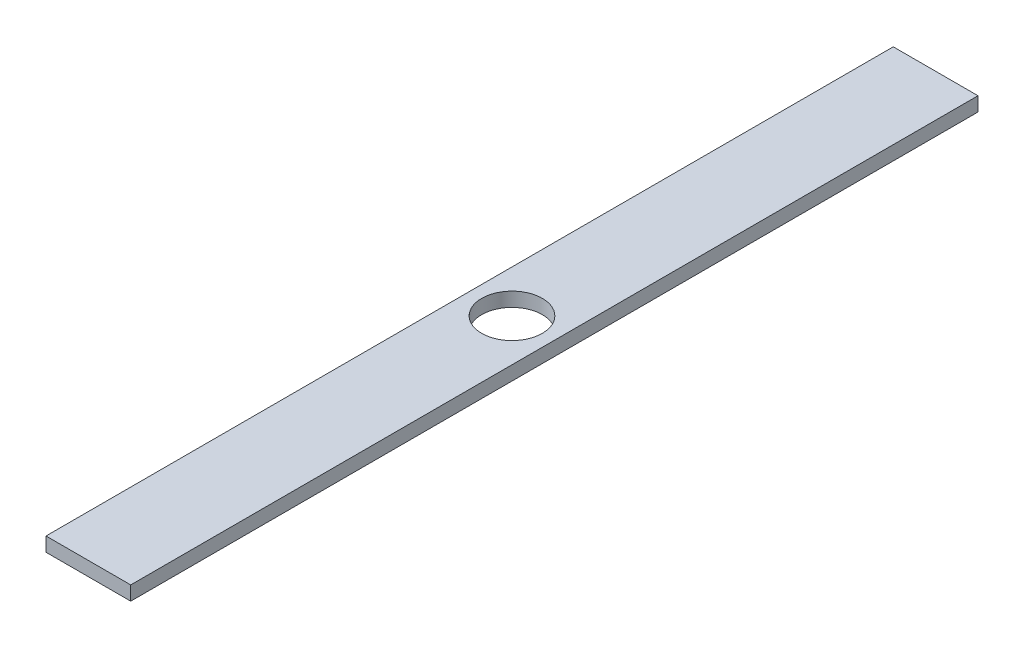
ISO-10303-21;
HEADER;
FILE_DESCRIPTION(('STEP AP214'),'2;1');
FILE_NAME('part.step','',(''),(''),'','','');
FILE_SCHEMA(('AUTOMOTIVE_DESIGN { 1 0 10303 214 1 1 1 1 }'));
ENDSEC;
DATA;
#1=APPLICATION_CONTEXT('core data for automotive mechanical design processes');
#2=APPLICATION_PROTOCOL_DEFINITION('international standard','automotive_design',2000,#1);
#3=PRODUCT_CONTEXT('',#1,'mechanical');
#4=PRODUCT('Part','Part','',(#3));
#5=PRODUCT_RELATED_PRODUCT_CATEGORY('part','',(#4));
#6=PRODUCT_DEFINITION_FORMATION('','',#4);
#7=PRODUCT_DEFINITION_CONTEXT('part definition',#1,'design');
#8=PRODUCT_DEFINITION('design','',#6,#7);
#9=PRODUCT_DEFINITION_SHAPE('','',#8);
#10=(LENGTH_UNIT() NAMED_UNIT(*) SI_UNIT(.MILLI.,.METRE.));
#11=(NAMED_UNIT(*) PLANE_ANGLE_UNIT() SI_UNIT($,.RADIAN.));
#12=(NAMED_UNIT(*) SI_UNIT($,.STERADIAN.) SOLID_ANGLE_UNIT());
#13=UNCERTAINTY_MEASURE_WITH_UNIT(LENGTH_MEASURE(1.E-05),#10,'distance_accuracy_value','');
#14=(GEOMETRIC_REPRESENTATION_CONTEXT(3) GLOBAL_UNCERTAINTY_ASSIGNED_CONTEXT((#13)) GLOBAL_UNIT_ASSIGNED_CONTEXT((#10,
#11,#12)) REPRESENTATION_CONTEXT('',''));
#15=CARTESIAN_POINT('',(0.,0.,0.));
#16=DIRECTION('',(0.,0.,1.));
#17=DIRECTION('',(1.,0.,0.));
#18=AXIS2_PLACEMENT_3D('',#15,#16,#17);
#19=CARTESIAN_POINT('',(0.,6.35,0.));
#20=DIRECTION('',(0.,-1.,0.));
#21=DIRECTION('',(0.,0.,-1.));
#22=AXIS2_PLACEMENT_3D('',#19,#20,#21);
#23=PLANE('',#22);
#24=DIRECTION('',(0.,0.,-1.));
#25=VECTOR('',#24,1.);
#26=CARTESIAN_POINT('',(19.05,6.35,190.5));
#27=LINE('',#26,#25);
#28=CARTESIAN_POINT('',(19.05,6.35,190.5));
#29=VERTEX_POINT('',#28);
#30=CARTESIAN_POINT('',(19.05,6.35,-190.5));
#31=VERTEX_POINT('',#30);
#32=EDGE_CURVE('E85',#29,#31,#27,.T.);
#33=ORIENTED_EDGE('',*,*,#32,.T.);
#34=DIRECTION('',(-1.,0.,0.));
#35=VECTOR('',#34,1.);
#36=CARTESIAN_POINT('',(-19.05,6.35,-190.5));
#37=LINE('',#36,#35);
#38=CARTESIAN_POINT('',(-19.05,6.35,-190.5));
#39=VERTEX_POINT('',#38);
#40=EDGE_CURVE('E80',#31,#39,#37,.T.);
#41=ORIENTED_EDGE('',*,*,#40,.T.);
#42=DIRECTION('',(0.,0.,1.));
#43=VECTOR('',#42,1.);
#44=CARTESIAN_POINT('',(-19.05,6.35,190.5));
#45=LINE('',#44,#43);
#46=CARTESIAN_POINT('',(-19.05,6.35,190.5));
#47=VERTEX_POINT('',#46);
#48=EDGE_CURVE('E83',#39,#47,#45,.T.);
#49=ORIENTED_EDGE('',*,*,#48,.T.);
#50=DIRECTION('',(1.,0.,0.));
#51=VECTOR('',#50,1.);
#52=CARTESIAN_POINT('',(-19.05,6.35,190.5));
#53=LINE('',#52,#51);
#54=EDGE_CURVE('E50',#47,#29,#53,.T.);
#55=ORIENTED_EDGE('',*,*,#54,.T.);
#56=EDGE_LOOP('',(#33,#41,#49,#55));
#57=FACE_BOUND('',#56,.T.);
#58=CARTESIAN_POINT('',(0.,6.35,0.));
#59=DIRECTION('',(0.,1.,0.));
#60=DIRECTION('',(0.,0.,1.));
#61=AXIS2_PLACEMENT_3D('',#58,#59,#60);
#62=CIRCLE('',#61,13.6319234191528);
#63=CARTESIAN_POINT('',(0.,6.35,13.6319234191528));
#64=VERTEX_POINT('',#63);
#65=EDGE_CURVE('E100',#64,#64,#62,.T.);
#66=ORIENTED_EDGE('',*,*,#65,.F.);
#67=EDGE_LOOP('',(#66));
#68=FACE_BOUND('',#67,.T.);
#69=ADVANCED_FACE('F33',(#57,#68),#23,.F.);
#70=CARTESIAN_POINT('',(0.,0.,0.));
#71=DIRECTION('',(0.,-1.,0.));
#72=DIRECTION('',(0.,0.,-1.));
#73=AXIS2_PLACEMENT_3D('',#70,#71,#72);
#74=PLANE('',#73);
#75=DIRECTION('',(0.,0.,-1.));
#76=VECTOR('',#75,1.);
#77=CARTESIAN_POINT('',(19.05,0.,190.5));
#78=LINE('',#77,#76);
#79=CARTESIAN_POINT('',(19.05,0.,190.5));
#80=VERTEX_POINT('',#79);
#81=CARTESIAN_POINT('',(19.05,0.,-190.5));
#82=VERTEX_POINT('',#81);
#83=EDGE_CURVE('E97',#80,#82,#78,.T.);
#84=ORIENTED_EDGE('',*,*,#83,.F.);
#85=DIRECTION('',(1.,0.,0.));
#86=VECTOR('',#85,1.);
#87=CARTESIAN_POINT('',(-19.05,0.,190.5));
#88=LINE('',#87,#86);
#89=CARTESIAN_POINT('',(-19.05,0.,190.5));
#90=VERTEX_POINT('',#89);
#91=EDGE_CURVE('E73',#90,#80,#88,.T.);
#92=ORIENTED_EDGE('',*,*,#91,.F.);
#93=DIRECTION('',(0.,0.,1.));
#94=VECTOR('',#93,1.);
#95=CARTESIAN_POINT('',(-19.05,0.,190.5));
#96=LINE('',#95,#94);
#97=CARTESIAN_POINT('',(-19.05,0.,-190.5));
#98=VERTEX_POINT('',#97);
#99=EDGE_CURVE('E67',#98,#90,#96,.T.);
#100=ORIENTED_EDGE('',*,*,#99,.F.);
#101=DIRECTION('',(-1.,0.,0.));
#102=VECTOR('',#101,1.);
#103=CARTESIAN_POINT('',(-19.05,0.,-190.5));
#104=LINE('',#103,#102);
#105=EDGE_CURVE('E89',#82,#98,#104,.T.);
#106=ORIENTED_EDGE('',*,*,#105,.F.);
#107=EDGE_LOOP('',(#84,#92,#100,#106));
#108=FACE_BOUND('',#107,.T.);
#109=CARTESIAN_POINT('',(0.,0.,0.));
#110=DIRECTION('',(0.,1.,0.));
#111=DIRECTION('',(0.,0.,1.));
#112=AXIS2_PLACEMENT_3D('',#109,#110,#111);
#113=CIRCLE('',#112,13.6319234191528);
#114=CARTESIAN_POINT('',(0.,0.,13.6319234191528));
#115=VERTEX_POINT('',#114);
#116=EDGE_CURVE('E112',#115,#115,#113,.T.);
#117=ORIENTED_EDGE('',*,*,#116,.T.);
#118=EDGE_LOOP('',(#117));
#119=FACE_BOUND('',#118,.T.);
#120=ADVANCED_FACE('F108',(#108,#119),#74,.T.);
#121=CARTESIAN_POINT('',(19.05,6.35,190.5));
#122=DIRECTION('',(-1.,0.,0.));
#123=DIRECTION('',(0.,0.,1.));
#124=AXIS2_PLACEMENT_3D('',#121,#122,#123);
#125=PLANE('',#124);
#126=ORIENTED_EDGE('',*,*,#83,.T.);
#127=DIRECTION('',(0.,-1.,0.));
#128=VECTOR('',#127,1.);
#129=CARTESIAN_POINT('',(19.05,6.35,-190.5));
#130=LINE('',#129,#128);
#131=EDGE_CURVE('E11',#31,#82,#130,.T.);
#132=ORIENTED_EDGE('',*,*,#131,.F.);
#133=ORIENTED_EDGE('',*,*,#32,.F.);
#134=DIRECTION('',(0.,-1.,0.));
#135=VECTOR('',#134,1.);
#136=CARTESIAN_POINT('',(19.05,6.35,190.5));
#137=LINE('',#136,#135);
#138=EDGE_CURVE('E93',#29,#80,#137,.T.);
#139=ORIENTED_EDGE('',*,*,#138,.T.);
#140=EDGE_LOOP('',(#126,#132,#133,#139));
#141=FACE_BOUND('',#140,.T.);
#142=ADVANCED_FACE('F35',(#141),#125,.F.);
#143=CARTESIAN_POINT('',(-19.05,6.35,-190.5));
#144=DIRECTION('',(0.,0.,1.));
#145=DIRECTION('',(1.,0.,0.));
#146=AXIS2_PLACEMENT_3D('',#143,#144,#145);
#147=PLANE('',#146);
#148=ORIENTED_EDGE('',*,*,#105,.T.);
#149=DIRECTION('',(0.,-1.,0.));
#150=VECTOR('',#149,1.);
#151=CARTESIAN_POINT('',(-19.05,6.35,-190.5));
#152=LINE('',#151,#150);
#153=EDGE_CURVE('E42',#39,#98,#152,.T.);
#154=ORIENTED_EDGE('',*,*,#153,.F.);
#155=ORIENTED_EDGE('',*,*,#40,.F.);
#156=ORIENTED_EDGE('',*,*,#131,.T.);
#157=EDGE_LOOP('',(#148,#154,#155,#156));
#158=FACE_BOUND('',#157,.T.);
#159=ADVANCED_FACE('F88',(#158),#147,.F.);
#160=CARTESIAN_POINT('',(-19.05,6.35,190.5));
#161=DIRECTION('',(1.,0.,0.));
#162=DIRECTION('',(0.,0.,-1.));
#163=AXIS2_PLACEMENT_3D('',#160,#161,#162);
#164=PLANE('',#163);
#165=ORIENTED_EDGE('',*,*,#99,.T.);
#166=DIRECTION('',(0.,-1.,0.));
#167=VECTOR('',#166,1.);
#168=CARTESIAN_POINT('',(-19.05,6.35,190.5));
#169=LINE('',#168,#167);
#170=EDGE_CURVE('E90',#47,#90,#169,.T.);
#171=ORIENTED_EDGE('',*,*,#170,.F.);
#172=ORIENTED_EDGE('',*,*,#48,.F.);
#173=ORIENTED_EDGE('',*,*,#153,.T.);
#174=EDGE_LOOP('',(#165,#171,#172,#173));
#175=FACE_BOUND('',#174,.T.);
#176=ADVANCED_FACE('F91',(#175),#164,.F.);
#177=CARTESIAN_POINT('',(-19.05,6.35,190.5));
#178=DIRECTION('',(0.,0.,-1.));
#179=DIRECTION('',(-1.,0.,0.));
#180=AXIS2_PLACEMENT_3D('',#177,#178,#179);
#181=PLANE('',#180);
#182=ORIENTED_EDGE('',*,*,#91,.T.);
#183=ORIENTED_EDGE('',*,*,#138,.F.);
#184=ORIENTED_EDGE('',*,*,#54,.F.);
#185=ORIENTED_EDGE('',*,*,#170,.T.);
#186=EDGE_LOOP('',(#182,#183,#184,#185));
#187=FACE_BOUND('',#186,.T.);
#188=ADVANCED_FACE('F105',(#187),#181,.F.);
#189=CARTESIAN_POINT('',(0.,6.35,0.));
#190=DIRECTION('',(0.,-1.,0.));
#191=DIRECTION('',(0.,0.,-1.));
#192=AXIS2_PLACEMENT_3D('',#189,#190,#191);
#193=CYLINDRICAL_SURFACE('',#192,13.6319234191528);
#194=ORIENTED_EDGE('',*,*,#65,.T.);
#195=EDGE_LOOP('',(#194));
#196=FACE_BOUND('',#195,.T.);
#197=ORIENTED_EDGE('',*,*,#116,.F.);
#198=EDGE_LOOP('',(#197));
#199=FACE_BOUND('',#198,.T.);
#200=ADVANCED_FACE('F118',(#196,#199),#193,.F.);
#201=CLOSED_SHELL('',(#69,#120,#142,#159,#176,#188,#200));
#202=MANIFOLD_SOLID_BREP('B2',#201);
#203=ADVANCED_BREP_SHAPE_REPRESENTATION('',(#18,#202),#14);
#204=SHAPE_DEFINITION_REPRESENTATION(#9,#203);
ENDSEC;
END-ISO-10303-21;
